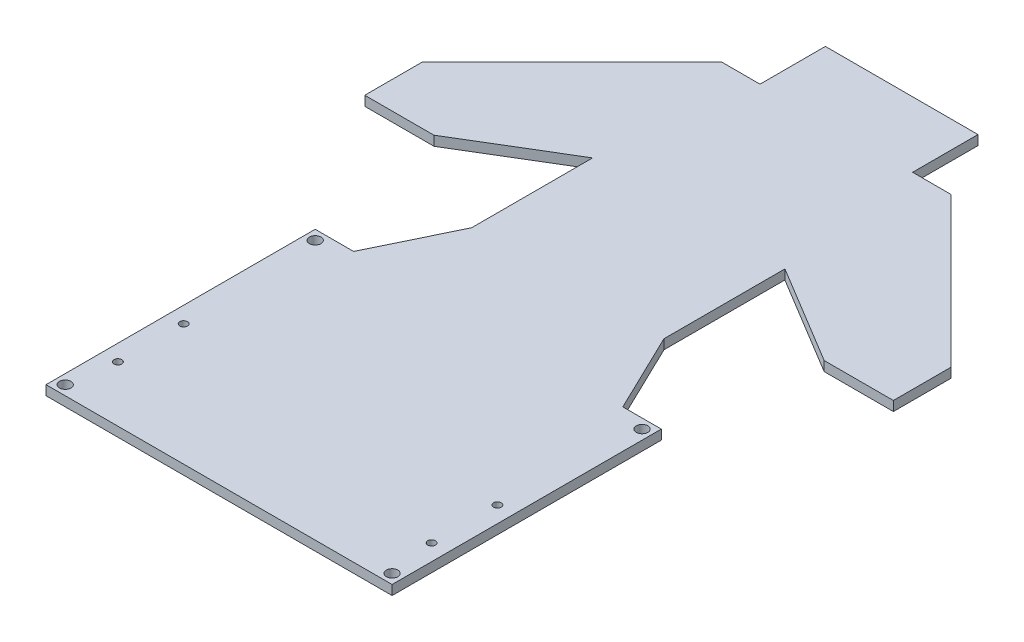
ISO-10303-21;
HEADER;
FILE_DESCRIPTION(('STEP AP214'),'2;1');
FILE_NAME('part.step','',(''),(''),'','','');
FILE_SCHEMA(('AUTOMOTIVE_DESIGN { 1 0 10303 214 1 1 1 1 }'));
ENDSEC;
DATA;
#1=APPLICATION_CONTEXT('core data for automotive mechanical design processes');
#2=APPLICATION_PROTOCOL_DEFINITION('international standard','automotive_design',2000,#1);
#3=PRODUCT_CONTEXT('',#1,'mechanical');
#4=PRODUCT('Part','Part','',(#3));
#5=PRODUCT_RELATED_PRODUCT_CATEGORY('part','',(#4));
#6=PRODUCT_DEFINITION_FORMATION('','',#4);
#7=PRODUCT_DEFINITION_CONTEXT('part definition',#1,'design');
#8=PRODUCT_DEFINITION('design','',#6,#7);
#9=PRODUCT_DEFINITION_SHAPE('','',#8);
#10=(LENGTH_UNIT() NAMED_UNIT(*) SI_UNIT(.MILLI.,.METRE.));
#11=(NAMED_UNIT(*) PLANE_ANGLE_UNIT() SI_UNIT($,.RADIAN.));
#12=(NAMED_UNIT(*) SI_UNIT($,.STERADIAN.) SOLID_ANGLE_UNIT());
#13=UNCERTAINTY_MEASURE_WITH_UNIT(LENGTH_MEASURE(1.E-05),#10,'distance_accuracy_value','');
#14=(GEOMETRIC_REPRESENTATION_CONTEXT(3) GLOBAL_UNCERTAINTY_ASSIGNED_CONTEXT((#13)) GLOBAL_UNIT_ASSIGNED_CONTEXT((#10,
#11,#12)) REPRESENTATION_CONTEXT('',''));
#15=CARTESIAN_POINT('',(0.,0.,0.));
#16=DIRECTION('',(0.,0.,1.));
#17=DIRECTION('',(1.,0.,0.));
#18=AXIS2_PLACEMENT_3D('',#15,#16,#17);
#19=CARTESIAN_POINT('',(-70.1250341022051,-2.5,-2.56438521356386));
#20=DIRECTION('',(-0.707045270994572,0.,-0.707168286028307));
#21=DIRECTION('',(-0.707168286028307,0.,0.707045270994572));
#22=AXIS2_PLACEMENT_3D('',#19,#20,#21);
#23=PLANE('',#22);
#24=DIRECTION('',(-0.707168286028307,0.,0.707045270994572));
#25=VECTOR('',#24,1.);
#26=CARTESIAN_POINT('',(-70.1250341022051,0.,-2.56438521356386));
#27=LINE('',#26,#25);
#28=CARTESIAN_POINT('',(-31.2307783706483,0.,-41.4518751182653));
#29=VERTEX_POINT('',#28);
#30=CARTESIAN_POINT('',(-70.1250341022051,0.,-2.56438521356386));
#31=VERTEX_POINT('',#30);
#32=EDGE_CURVE('E217',#29,#31,#27,.T.);
#33=ORIENTED_EDGE('',*,*,#32,.F.);
#34=DIRECTION('',(0.,1.,0.));
#35=VECTOR('',#34,1.);
#36=CARTESIAN_POINT('',(-31.2307783706483,-2.5,-41.4518751182653));
#37=LINE('',#36,#35);
#38=CARTESIAN_POINT('',(-31.2307783706483,-2.5,-41.4518751182653));
#39=VERTEX_POINT('',#38);
#40=EDGE_CURVE('E11',#39,#29,#37,.T.);
#41=ORIENTED_EDGE('',*,*,#40,.F.);
#42=DIRECTION('',(-0.707168286028307,0.,0.707045270994572));
#43=VECTOR('',#42,1.);
#44=CARTESIAN_POINT('',(-70.1250341022051,-2.5,-2.56438521356386));
#45=LINE('',#44,#43);
#46=CARTESIAN_POINT('',(-70.1250341022051,-2.5,-2.56438521356386));
#47=VERTEX_POINT('',#46);
#48=EDGE_CURVE('E280',#39,#47,#45,.T.);
#49=ORIENTED_EDGE('',*,*,#48,.T.);
#50=DIRECTION('',(0.,1.,0.));
#51=VECTOR('',#50,1.);
#52=CARTESIAN_POINT('',(-70.1250341022051,-2.5,-2.56438521356386));
#53=LINE('',#52,#51);
#54=EDGE_CURVE('E39',#47,#31,#53,.T.);
#55=ORIENTED_EDGE('',*,*,#54,.T.);
#56=EDGE_LOOP('',(#33,#41,#49,#55));
#57=FACE_BOUND('',#56,.T.);
#58=ADVANCED_FACE('F36',(#57),#23,.T.);
#59=CARTESIAN_POINT('',(-31.2307783706483,-2.5,-41.4518751182653));
#60=DIRECTION('',(0.,0.,-1.));
#61=DIRECTION('',(-1.,0.,0.));
#62=AXIS2_PLACEMENT_3D('',#59,#60,#61);
#63=PLANE('',#62);
#64=DIRECTION('',(-1.,0.,0.));
#65=VECTOR('',#64,1.);
#66=CARTESIAN_POINT('',(-31.2307783706483,0.,-41.4518751182653));
#67=LINE('',#66,#65);
#68=CARTESIAN_POINT('',(-21.2307783706483,0.,-41.4518751182653));
#69=VERTEX_POINT('',#68);
#70=EDGE_CURVE('E278',#69,#29,#67,.T.);
#71=ORIENTED_EDGE('',*,*,#70,.F.);
#72=DIRECTION('',(0.,1.,0.));
#73=VECTOR('',#72,1.);
#74=CARTESIAN_POINT('',(-21.2307783706483,-2.5,-41.4518751182653));
#75=LINE('',#74,#73);
#76=CARTESIAN_POINT('',(-21.2307783706483,-2.5,-41.4518751182653));
#77=VERTEX_POINT('',#76);
#78=EDGE_CURVE('E45',#77,#69,#75,.T.);
#79=ORIENTED_EDGE('',*,*,#78,.F.);
#80=DIRECTION('',(-1.,0.,0.));
#81=VECTOR('',#80,1.);
#82=CARTESIAN_POINT('',(-31.2307783706483,-2.5,-41.4518751182653));
#83=LINE('',#82,#81);
#84=EDGE_CURVE('E207',#77,#39,#83,.T.);
#85=ORIENTED_EDGE('',*,*,#84,.T.);
#86=ORIENTED_EDGE('',*,*,#40,.T.);
#87=EDGE_LOOP('',(#71,#79,#85,#86));
#88=FACE_BOUND('',#87,.T.);
#89=ADVANCED_FACE('F320',(#88),#63,.T.);
#90=CARTESIAN_POINT('',(-21.2307783706483,-2.5,-41.4518751182653));
#91=DIRECTION('',(-1.,0.,0.));
#92=DIRECTION('',(0.,0.,1.));
#93=AXIS2_PLACEMENT_3D('',#90,#91,#92);
#94=PLANE('',#93);
#95=DIRECTION('',(0.,0.,1.));
#96=VECTOR('',#95,1.);
#97=CARTESIAN_POINT('',(-21.2307783706483,0.,-41.4518751182653));
#98=LINE('',#97,#96);
#99=CARTESIAN_POINT('',(-21.2307783706483,0.,-58.4518751182653));
#100=VERTEX_POINT('',#99);
#101=EDGE_CURVE('E194',#100,#69,#98,.T.);
#102=ORIENTED_EDGE('',*,*,#101,.F.);
#103=DIRECTION('',(0.,1.,0.));
#104=VECTOR('',#103,1.);
#105=CARTESIAN_POINT('',(-21.2307783706483,-2.5,-58.4518751182653));
#106=LINE('',#105,#104);
#107=CARTESIAN_POINT('',(-21.2307783706483,-2.5,-58.4518751182653));
#108=VERTEX_POINT('',#107);
#109=EDGE_CURVE('E189',#108,#100,#106,.T.);
#110=ORIENTED_EDGE('',*,*,#109,.F.);
#111=DIRECTION('',(0.,0.,1.));
#112=VECTOR('',#111,1.);
#113=CARTESIAN_POINT('',(-21.2307783706483,-2.5,-41.4518751182653));
#114=LINE('',#113,#112);
#115=EDGE_CURVE('E192',#108,#77,#114,.T.);
#116=ORIENTED_EDGE('',*,*,#115,.T.);
#117=ORIENTED_EDGE('',*,*,#78,.T.);
#118=EDGE_LOOP('',(#102,#110,#116,#117));
#119=FACE_BOUND('',#118,.T.);
#120=ADVANCED_FACE('F191',(#119),#94,.T.);
#121=CARTESIAN_POINT('',(-21.2307783706483,-2.5,-58.4518751182653));
#122=DIRECTION('',(0.,0.,-1.));
#123=DIRECTION('',(-1.,0.,0.));
#124=AXIS2_PLACEMENT_3D('',#121,#122,#123);
#125=PLANE('',#124);
#126=DIRECTION('',(-1.,0.,0.));
#127=VECTOR('',#126,1.);
#128=CARTESIAN_POINT('',(-21.2307783706483,0.,-58.4518751182653));
#129=LINE('',#128,#127);
#130=CARTESIAN_POINT('',(18.4572130723463,0.,-58.4518751182653));
#131=VERTEX_POINT('',#130);
#132=EDGE_CURVE('E275',#131,#100,#129,.T.);
#133=ORIENTED_EDGE('',*,*,#132,.F.);
#134=DIRECTION('',(0.,1.,0.));
#135=VECTOR('',#134,1.);
#136=CARTESIAN_POINT('',(18.4572130723463,-2.5,-58.4518751182653));
#137=LINE('',#136,#135);
#138=CARTESIAN_POINT('',(18.4572130723463,-2.5,-58.4518751182653));
#139=VERTEX_POINT('',#138);
#140=EDGE_CURVE('E199',#139,#131,#137,.T.);
#141=ORIENTED_EDGE('',*,*,#140,.F.);
#142=DIRECTION('',(-1.,0.,0.));
#143=VECTOR('',#142,1.);
#144=CARTESIAN_POINT('',(-21.2307783706483,-2.5,-58.4518751182653));
#145=LINE('',#144,#143);
#146=EDGE_CURVE('E205',#139,#108,#145,.T.);
#147=ORIENTED_EDGE('',*,*,#146,.T.);
#148=ORIENTED_EDGE('',*,*,#109,.T.);
#149=EDGE_LOOP('',(#133,#141,#147,#148));
#150=FACE_BOUND('',#149,.T.);
#151=ADVANCED_FACE('F209',(#150),#125,.T.);
#152=CARTESIAN_POINT('',(18.4572130723463,-2.5,-58.4518751182653));
#153=DIRECTION('',(1.,0.,0.));
#154=DIRECTION('',(0.,0.,-1.));
#155=AXIS2_PLACEMENT_3D('',#152,#153,#154);
#156=PLANE('',#155);
#157=DIRECTION('',(0.,0.,-1.));
#158=VECTOR('',#157,1.);
#159=CARTESIAN_POINT('',(18.4572130723463,0.,-58.4518751182653));
#160=LINE('',#159,#158);
#161=CARTESIAN_POINT('',(18.4572130723463,0.,-41.4518751182653));
#162=VERTEX_POINT('',#161);
#163=EDGE_CURVE('E272',#162,#131,#160,.T.);
#164=ORIENTED_EDGE('',*,*,#163,.F.);
#165=DIRECTION('',(0.,1.,0.));
#166=VECTOR('',#165,1.);
#167=CARTESIAN_POINT('',(18.4572130723463,-2.5,-41.4518751182653));
#168=LINE('',#167,#166);
#169=CARTESIAN_POINT('',(18.4572130723463,-2.5,-41.4518751182653));
#170=VERTEX_POINT('',#169);
#171=EDGE_CURVE('E284',#170,#162,#168,.T.);
#172=ORIENTED_EDGE('',*,*,#171,.F.);
#173=DIRECTION('',(0.,0.,-1.));
#174=VECTOR('',#173,1.);
#175=CARTESIAN_POINT('',(18.4572130723463,-2.5,-58.4518751182653));
#176=LINE('',#175,#174);
#177=EDGE_CURVE('E210',#170,#139,#176,.T.);
#178=ORIENTED_EDGE('',*,*,#177,.T.);
#179=ORIENTED_EDGE('',*,*,#140,.T.);
#180=EDGE_LOOP('',(#164,#172,#178,#179));
#181=FACE_BOUND('',#180,.T.);
#182=ADVANCED_FACE('F333',(#181),#156,.T.);
#183=CARTESIAN_POINT('',(18.4572130723463,-2.5,-41.4518751182653));
#184=DIRECTION('',(0.,0.,-1.));
#185=DIRECTION('',(-1.,0.,0.));
#186=AXIS2_PLACEMENT_3D('',#183,#184,#185);
#187=PLANE('',#186);
#188=DIRECTION('',(-1.,0.,0.));
#189=VECTOR('',#188,1.);
#190=CARTESIAN_POINT('',(18.4572130723463,0.,-41.4518751182653));
#191=LINE('',#190,#189);
#192=CARTESIAN_POINT('',(28.4572130723463,0.,-41.4518751182653));
#193=VERTEX_POINT('',#192);
#194=EDGE_CURVE('E269',#193,#162,#191,.T.);
#195=ORIENTED_EDGE('',*,*,#194,.F.);
#196=DIRECTION('',(0.,1.,0.));
#197=VECTOR('',#196,1.);
#198=CARTESIAN_POINT('',(28.4572130723463,-2.5,-41.4518751182653));
#199=LINE('',#198,#197);
#200=CARTESIAN_POINT('',(28.4572130723463,-2.5,-41.4518751182653));
#201=VERTEX_POINT('',#200);
#202=EDGE_CURVE('E286',#201,#193,#199,.T.);
#203=ORIENTED_EDGE('',*,*,#202,.F.);
#204=DIRECTION('',(-1.,0.,0.));
#205=VECTOR('',#204,1.);
#206=CARTESIAN_POINT('',(18.4572130723463,-2.5,-41.4518751182653));
#207=LINE('',#206,#205);
#208=EDGE_CURVE('E212',#201,#170,#207,.T.);
#209=ORIENTED_EDGE('',*,*,#208,.T.);
#210=ORIENTED_EDGE('',*,*,#171,.T.);
#211=EDGE_LOOP('',(#195,#203,#209,#210));
#212=FACE_BOUND('',#211,.T.);
#213=ADVANCED_FACE('F336',(#212),#187,.T.);
#214=CARTESIAN_POINT('',(28.4572130723463,-2.5,-41.4518751182653));
#215=DIRECTION('',(0.707168286028307,0.,-0.707045270994571));
#216=DIRECTION('',(-0.707045270994572,0.,-0.707168286028307));
#217=AXIS2_PLACEMENT_3D('',#214,#215,#216);
#218=PLANE('',#217);
#219=DIRECTION('',(-0.707045270994571,0.,-0.707168286028307));
#220=VECTOR('',#219,1.);
#221=CARTESIAN_POINT('',(28.4572130723463,0.,-41.4518751182653));
#222=LINE('',#221,#220);
#223=CARTESIAN_POINT('',(67.3447029770478,0.,-2.55761938670842));
#224=VERTEX_POINT('',#223);
#225=EDGE_CURVE('E266',#224,#193,#222,.T.);
#226=ORIENTED_EDGE('',*,*,#225,.F.);
#227=DIRECTION('',(0.,1.,0.));
#228=VECTOR('',#227,1.);
#229=CARTESIAN_POINT('',(67.3447029770478,-2.5,-2.55761938670842));
#230=LINE('',#229,#228);
#231=CARTESIAN_POINT('',(67.3447029770478,-2.5,-2.55761938670842));
#232=VERTEX_POINT('',#231);
#233=EDGE_CURVE('E288',#232,#224,#230,.T.);
#234=ORIENTED_EDGE('',*,*,#233,.F.);
#235=DIRECTION('',(-0.707045270994571,0.,-0.707168286028307));
#236=VECTOR('',#235,1.);
#237=CARTESIAN_POINT('',(28.4572130723463,-2.5,-41.4518751182653));
#238=LINE('',#237,#236);
#239=EDGE_CURVE('E541',#232,#201,#238,.T.);
#240=ORIENTED_EDGE('',*,*,#239,.T.);
#241=ORIENTED_EDGE('',*,*,#202,.T.);
#242=EDGE_LOOP('',(#226,#234,#240,#241));
#243=FACE_BOUND('',#242,.T.);
#244=ADVANCED_FACE('F340',(#243),#218,.T.);
#245=CARTESIAN_POINT('',(67.3447029770478,-2.5,-2.55761938670842));
#246=DIRECTION('',(1.,0.,0.));
#247=DIRECTION('',(0.,0.,-1.));
#248=AXIS2_PLACEMENT_3D('',#245,#246,#247);
#249=PLANE('',#248);
#250=DIRECTION('',(0.,0.,-1.));
#251=VECTOR('',#250,1.);
#252=CARTESIAN_POINT('',(67.3447029770478,0.,-2.55761938670842));
#253=LINE('',#252,#251);
#254=CARTESIAN_POINT('',(67.3447029770478,0.,12.4423806132916));
#255=VERTEX_POINT('',#254);
#256=EDGE_CURVE('E263',#255,#224,#253,.T.);
#257=ORIENTED_EDGE('',*,*,#256,.F.);
#258=DIRECTION('',(0.,1.,0.));
#259=VECTOR('',#258,1.);
#260=CARTESIAN_POINT('',(67.3447029770478,-2.5,12.4423806132916));
#261=LINE('',#260,#259);
#262=CARTESIAN_POINT('',(67.3447029770478,-2.5,12.4423806132916));
#263=VERTEX_POINT('',#262);
#264=EDGE_CURVE('E290',#263,#255,#261,.T.);
#265=ORIENTED_EDGE('',*,*,#264,.F.);
#266=DIRECTION('',(0.,0.,-1.));
#267=VECTOR('',#266,1.);
#268=CARTESIAN_POINT('',(67.3447029770478,-2.5,-2.55761938670842));
#269=LINE('',#268,#267);
#270=EDGE_CURVE('E538',#263,#232,#269,.T.);
#271=ORIENTED_EDGE('',*,*,#270,.T.);
#272=ORIENTED_EDGE('',*,*,#233,.T.);
#273=EDGE_LOOP('',(#257,#265,#271,#272));
#274=FACE_BOUND('',#273,.T.);
#275=ADVANCED_FACE('F344',(#274),#249,.T.);
#276=CARTESIAN_POINT('',(67.3447029770478,-2.5,12.4423806132916));
#277=DIRECTION('',(0.,0.,1.));
#278=DIRECTION('',(1.,0.,0.));
#279=AXIS2_PLACEMENT_3D('',#276,#277,#278);
#280=PLANE('',#279);
#281=DIRECTION('',(1.,0.,0.));
#282=VECTOR('',#281,1.);
#283=CARTESIAN_POINT('',(67.3447029770478,0.,12.4423806132916));
#284=LINE('',#283,#282);
#285=CARTESIAN_POINT('',(49.3447029770478,0.,12.4423806132916));
#286=VERTEX_POINT('',#285);
#287=EDGE_CURVE('E260',#286,#255,#284,.T.);
#288=ORIENTED_EDGE('',*,*,#287,.F.);
#289=DIRECTION('',(0.,1.,0.));
#290=VECTOR('',#289,1.);
#291=CARTESIAN_POINT('',(49.3447029770478,-2.5,12.4423806132916));
#292=LINE('',#291,#290);
#293=CARTESIAN_POINT('',(49.3447029770478,-2.5,12.4423806132916));
#294=VERTEX_POINT('',#293);
#295=EDGE_CURVE('E292',#294,#286,#292,.T.);
#296=ORIENTED_EDGE('',*,*,#295,.F.);
#297=DIRECTION('',(1.,0.,0.));
#298=VECTOR('',#297,1.);
#299=CARTESIAN_POINT('',(67.3447029770478,-2.5,12.4423806132916));
#300=LINE('',#299,#298);
#301=EDGE_CURVE('E535',#294,#263,#300,.T.);
#302=ORIENTED_EDGE('',*,*,#301,.T.);
#303=ORIENTED_EDGE('',*,*,#264,.T.);
#304=EDGE_LOOP('',(#288,#296,#302,#303));
#305=FACE_BOUND('',#304,.T.);
#306=ADVANCED_FACE('F348',(#305),#280,.T.);
#307=CARTESIAN_POINT('',(23.6118753411253,-2.5,-3.08678788269153));
#308=DIRECTION('',(-0.516682968311014,0.,0.856176798481084));
#309=DIRECTION('',(0.856176798481084,0.,0.516682968311014));
#310=AXIS2_PLACEMENT_3D('',#307,#308,#309);
#311=PLANE('',#310);
#312=DIRECTION('',(0.856176798481084,0.,0.516682968311014));
#313=VECTOR('',#312,1.);
#314=CARTESIAN_POINT('',(23.6118753411253,0.,-3.08678788269153));
#315=LINE('',#314,#313);
#316=CARTESIAN_POINT('',(23.6118753411253,0.,-3.08678788269153));
#317=VERTEX_POINT('',#316);
#318=EDGE_CURVE('E257',#317,#286,#315,.T.);
#319=ORIENTED_EDGE('',*,*,#318,.F.);
#320=DIRECTION('',(0.,1.,0.));
#321=VECTOR('',#320,1.);
#322=CARTESIAN_POINT('',(23.6118753411253,-2.5,-3.08678788269153));
#323=LINE('',#322,#321);
#324=CARTESIAN_POINT('',(23.6118753411253,-2.5,-3.08678788269153));
#325=VERTEX_POINT('',#324);
#326=EDGE_CURVE('E294',#325,#317,#323,.T.);
#327=ORIENTED_EDGE('',*,*,#326,.F.);
#328=DIRECTION('',(0.856176798481084,0.,0.516682968311014));
#329=VECTOR('',#328,1.);
#330=CARTESIAN_POINT('',(23.6118753411253,-2.5,-3.08678788269153));
#331=LINE('',#330,#329);
#332=EDGE_CURVE('E532',#325,#294,#331,.T.);
#333=ORIENTED_EDGE('',*,*,#332,.T.);
#334=ORIENTED_EDGE('',*,*,#295,.T.);
#335=EDGE_LOOP('',(#319,#327,#333,#334));
#336=FACE_BOUND('',#335,.T.);
#337=ADVANCED_FACE('F352',(#336),#311,.T.);
#338=CARTESIAN_POINT('',(23.6118753411253,-2.5,28.3689413328497));
#339=DIRECTION('',(1.,0.,0.));
#340=DIRECTION('',(0.,0.,-1.));
#341=AXIS2_PLACEMENT_3D('',#338,#339,#340);
#342=PLANE('',#341);
#343=DIRECTION('',(0.,0.,-1.));
#344=VECTOR('',#343,1.);
#345=CARTESIAN_POINT('',(23.6118753411253,0.,28.3689413328497));
#346=LINE('',#345,#344);
#347=CARTESIAN_POINT('',(23.6118753411253,0.,28.3689413328497));
#348=VERTEX_POINT('',#347);
#349=EDGE_CURVE('E254',#348,#317,#346,.T.);
#350=ORIENTED_EDGE('',*,*,#349,.F.);
#351=DIRECTION('',(0.,1.,0.));
#352=VECTOR('',#351,1.);
#353=CARTESIAN_POINT('',(23.6118753411253,-2.5,28.3689413328497));
#354=LINE('',#353,#352);
#355=CARTESIAN_POINT('',(23.6118753411253,-2.5,28.3689413328497));
#356=VERTEX_POINT('',#355);
#357=EDGE_CURVE('E296',#356,#348,#354,.T.);
#358=ORIENTED_EDGE('',*,*,#357,.F.);
#359=DIRECTION('',(0.,0.,-1.));
#360=VECTOR('',#359,1.);
#361=CARTESIAN_POINT('',(23.6118753411253,-2.5,28.3689413328497));
#362=LINE('',#361,#360);
#363=EDGE_CURVE('E529',#356,#325,#362,.T.);
#364=ORIENTED_EDGE('',*,*,#363,.T.);
#365=ORIENTED_EDGE('',*,*,#326,.T.);
#366=EDGE_LOOP('',(#350,#358,#364,#365));
#367=FACE_BOUND('',#366,.T.);
#368=ADVANCED_FACE('F356',(#367),#342,.T.);
#369=CARTESIAN_POINT('',(23.6118753411253,-2.5,28.3689413328497));
#370=DIRECTION('',(0.900375036184463,0.,-0.435114690875666));
#371=DIRECTION('',(-0.435114690875666,0.,-0.900375036184463));
#372=AXIS2_PLACEMENT_3D('',#369,#370,#371);
#373=PLANE('',#372);
#374=DIRECTION('',(-0.435114690875666,0.,-0.900375036184463));
#375=VECTOR('',#374,1.);
#376=CARTESIAN_POINT('',(23.6118753411253,0.,28.3689413328497));
#377=LINE('',#376,#375);
#378=CARTESIAN_POINT('',(33.6118753411252,0.,49.0617622158326));
#379=VERTEX_POINT('',#378);
#380=EDGE_CURVE('E251',#379,#348,#377,.T.);
#381=ORIENTED_EDGE('',*,*,#380,.F.);
#382=DIRECTION('',(0.,1.,0.));
#383=VECTOR('',#382,1.);
#384=CARTESIAN_POINT('',(33.6118753411252,-2.5,49.0617622158326));
#385=LINE('',#384,#383);
#386=CARTESIAN_POINT('',(33.6118753411252,-2.5,49.0617622158326));
#387=VERTEX_POINT('',#386);
#388=EDGE_CURVE('E298',#387,#379,#385,.T.);
#389=ORIENTED_EDGE('',*,*,#388,.F.);
#390=DIRECTION('',(-0.435114690875666,0.,-0.900375036184463));
#391=VECTOR('',#390,1.);
#392=CARTESIAN_POINT('',(23.6118753411253,-2.5,28.3689413328497));
#393=LINE('',#392,#391);
#394=EDGE_CURVE('E526',#387,#356,#393,.T.);
#395=ORIENTED_EDGE('',*,*,#394,.T.);
#396=ORIENTED_EDGE('',*,*,#357,.T.);
#397=EDGE_LOOP('',(#381,#389,#395,#396));
#398=FACE_BOUND('',#397,.T.);
#399=ADVANCED_FACE('F360',(#398),#373,.T.);
#400=CARTESIAN_POINT('',(43.6118753411252,-2.5,49.0617622158326));
#401=DIRECTION('',(0.,0.,-1.));
#402=DIRECTION('',(-1.,0.,0.));
#403=AXIS2_PLACEMENT_3D('',#400,#401,#402);
#404=PLANE('',#403);
#405=DIRECTION('',(-1.,0.,0.));
#406=VECTOR('',#405,1.);
#407=CARTESIAN_POINT('',(43.6118753411252,0.,49.0617622158326));
#408=LINE('',#407,#406);
#409=CARTESIAN_POINT('',(43.6118753411252,0.,49.0617622158326));
#410=VERTEX_POINT('',#409);
#411=EDGE_CURVE('E248',#410,#379,#408,.T.);
#412=ORIENTED_EDGE('',*,*,#411,.F.);
#413=DIRECTION('',(0.,1.,0.));
#414=VECTOR('',#413,1.);
#415=CARTESIAN_POINT('',(43.6118753411252,-2.5,49.0617622158326));
#416=LINE('',#415,#414);
#417=CARTESIAN_POINT('',(43.6118753411252,-2.5,49.0617622158326));
#418=VERTEX_POINT('',#417);
#419=EDGE_CURVE('E300',#418,#410,#416,.T.);
#420=ORIENTED_EDGE('',*,*,#419,.F.);
#421=DIRECTION('',(-1.,0.,0.));
#422=VECTOR('',#421,1.);
#423=CARTESIAN_POINT('',(43.6118753411252,-2.5,49.0617622158326));
#424=LINE('',#423,#422);
#425=EDGE_CURVE('E523',#418,#387,#424,.T.);
#426=ORIENTED_EDGE('',*,*,#425,.T.);
#427=ORIENTED_EDGE('',*,*,#388,.T.);
#428=EDGE_LOOP('',(#412,#420,#426,#427));
#429=FACE_BOUND('',#428,.T.);
#430=ADVANCED_FACE('F364',(#429),#404,.T.);
#431=CARTESIAN_POINT('',(43.6118753411252,-2.5,119.061762215833));
#432=DIRECTION('',(1.,0.,0.));
#433=DIRECTION('',(0.,0.,-1.));
#434=AXIS2_PLACEMENT_3D('',#431,#432,#433);
#435=PLANE('',#434);
#436=DIRECTION('',(0.,0.,-1.));
#437=VECTOR('',#436,1.);
#438=CARTESIAN_POINT('',(43.6118753411252,0.,119.061762215833));
#439=LINE('',#438,#437);
#440=CARTESIAN_POINT('',(43.6118753411252,0.,119.061762215833));
#441=VERTEX_POINT('',#440);
#442=EDGE_CURVE('E245',#441,#410,#439,.T.);
#443=ORIENTED_EDGE('',*,*,#442,.F.);
#444=DIRECTION('',(0.,1.,0.));
#445=VECTOR('',#444,1.);
#446=CARTESIAN_POINT('',(43.6118753411252,-2.5,119.061762215833));
#447=LINE('',#446,#445);
#448=CARTESIAN_POINT('',(43.6118753411252,-2.5,119.061762215833));
#449=VERTEX_POINT('',#448);
#450=EDGE_CURVE('E302',#449,#441,#447,.T.);
#451=ORIENTED_EDGE('',*,*,#450,.F.);
#452=DIRECTION('',(0.,0.,-1.));
#453=VECTOR('',#452,1.);
#454=CARTESIAN_POINT('',(43.6118753411252,-2.5,119.061762215833));
#455=LINE('',#454,#453);
#456=EDGE_CURVE('E520',#449,#418,#455,.T.);
#457=ORIENTED_EDGE('',*,*,#456,.T.);
#458=ORIENTED_EDGE('',*,*,#419,.T.);
#459=EDGE_LOOP('',(#443,#451,#457,#458));
#460=FACE_BOUND('',#459,.T.);
#461=ADVANCED_FACE('F368',(#460),#435,.T.);
#462=CARTESIAN_POINT('',(-46.3881246588748,-2.5,119.061762215833));
#463=DIRECTION('',(0.,0.,1.));
#464=DIRECTION('',(1.,0.,0.));
#465=AXIS2_PLACEMENT_3D('',#462,#463,#464);
#466=PLANE('',#465);
#467=DIRECTION('',(1.,0.,0.));
#468=VECTOR('',#467,1.);
#469=CARTESIAN_POINT('',(-46.3881246588748,0.,119.061762215833));
#470=LINE('',#469,#468);
#471=CARTESIAN_POINT('',(-46.3881246588748,0.,119.061762215833));
#472=VERTEX_POINT('',#471);
#473=EDGE_CURVE('E242',#472,#441,#470,.T.);
#474=ORIENTED_EDGE('',*,*,#473,.F.);
#475=DIRECTION('',(0.,1.,0.));
#476=VECTOR('',#475,1.);
#477=CARTESIAN_POINT('',(-46.3881246588748,-2.5,119.061762215833));
#478=LINE('',#477,#476);
#479=CARTESIAN_POINT('',(-46.3881246588748,-2.5,119.061762215833));
#480=VERTEX_POINT('',#479);
#481=EDGE_CURVE('E304',#480,#472,#478,.T.);
#482=ORIENTED_EDGE('',*,*,#481,.F.);
#483=DIRECTION('',(1.,0.,0.));
#484=VECTOR('',#483,1.);
#485=CARTESIAN_POINT('',(-46.3881246588748,-2.5,119.061762215833));
#486=LINE('',#485,#484);
#487=EDGE_CURVE('E517',#480,#449,#486,.T.);
#488=ORIENTED_EDGE('',*,*,#487,.T.);
#489=ORIENTED_EDGE('',*,*,#450,.T.);
#490=EDGE_LOOP('',(#474,#482,#488,#489));
#491=FACE_BOUND('',#490,.T.);
#492=ADVANCED_FACE('F372',(#491),#466,.T.);
#493=CARTESIAN_POINT('',(-46.3881246588748,-2.5,49.0617622158326));
#494=DIRECTION('',(-1.,0.,0.));
#495=DIRECTION('',(0.,0.,1.));
#496=AXIS2_PLACEMENT_3D('',#493,#494,#495);
#497=PLANE('',#496);
#498=DIRECTION('',(0.,0.,1.));
#499=VECTOR('',#498,1.);
#500=CARTESIAN_POINT('',(-46.3881246588748,0.,49.0617622158326));
#501=LINE('',#500,#499);
#502=CARTESIAN_POINT('',(-46.3881246588748,0.,49.0617622158326));
#503=VERTEX_POINT('',#502);
#504=EDGE_CURVE('E239',#503,#472,#501,.T.);
#505=ORIENTED_EDGE('',*,*,#504,.F.);
#506=DIRECTION('',(0.,1.,0.));
#507=VECTOR('',#506,1.);
#508=CARTESIAN_POINT('',(-46.3881246588748,-2.5,49.0617622158326));
#509=LINE('',#508,#507);
#510=CARTESIAN_POINT('',(-46.3881246588748,-2.5,49.0617622158326));
#511=VERTEX_POINT('',#510);
#512=EDGE_CURVE('E306',#511,#503,#509,.T.);
#513=ORIENTED_EDGE('',*,*,#512,.F.);
#514=DIRECTION('',(0.,0.,1.));
#515=VECTOR('',#514,1.);
#516=CARTESIAN_POINT('',(-46.3881246588748,-2.5,49.0617622158326));
#517=LINE('',#516,#515);
#518=EDGE_CURVE('E514',#511,#480,#517,.T.);
#519=ORIENTED_EDGE('',*,*,#518,.T.);
#520=ORIENTED_EDGE('',*,*,#481,.T.);
#521=EDGE_LOOP('',(#505,#513,#519,#520));
#522=FACE_BOUND('',#521,.T.);
#523=ADVANCED_FACE('F376',(#522),#497,.T.);
#524=CARTESIAN_POINT('',(-36.3881246588747,-2.5,49.0617622158326));
#525=DIRECTION('',(0.,0.,-1.));
#526=DIRECTION('',(-1.,0.,0.));
#527=AXIS2_PLACEMENT_3D('',#524,#525,#526);
#528=PLANE('',#527);
#529=DIRECTION('',(-1.,0.,0.));
#530=VECTOR('',#529,1.);
#531=CARTESIAN_POINT('',(-36.3881246588747,0.,49.0617622158326));
#532=LINE('',#531,#530);
#533=CARTESIAN_POINT('',(-36.3881246588747,0.,49.0617622158326));
#534=VERTEX_POINT('',#533);
#535=EDGE_CURVE('E236',#534,#503,#532,.T.);
#536=ORIENTED_EDGE('',*,*,#535,.F.);
#537=DIRECTION('',(0.,1.,0.));
#538=VECTOR('',#537,1.);
#539=CARTESIAN_POINT('',(-36.3881246588747,-2.5,49.0617622158326));
#540=LINE('',#539,#538);
#541=CARTESIAN_POINT('',(-36.3881246588747,-2.5,49.0617622158326));
#542=VERTEX_POINT('',#541);
#543=EDGE_CURVE('E308',#542,#534,#540,.T.);
#544=ORIENTED_EDGE('',*,*,#543,.F.);
#545=DIRECTION('',(-1.,0.,0.));
#546=VECTOR('',#545,1.);
#547=CARTESIAN_POINT('',(-36.3881246588747,-2.5,49.0617622158326));
#548=LINE('',#547,#546);
#549=EDGE_CURVE('E511',#542,#511,#548,.T.);
#550=ORIENTED_EDGE('',*,*,#549,.T.);
#551=ORIENTED_EDGE('',*,*,#512,.T.);
#552=EDGE_LOOP('',(#536,#544,#550,#551));
#553=FACE_BOUND('',#552,.T.);
#554=ADVANCED_FACE('F380',(#553),#528,.T.);
#555=CARTESIAN_POINT('',(-36.3881246588747,-2.5,49.0617622158326));
#556=DIRECTION('',(-0.900375036184463,0.,-0.435114690875667));
#557=DIRECTION('',(-0.435114690875667,0.,0.900375036184463));
#558=AXIS2_PLACEMENT_3D('',#555,#556,#557);
#559=PLANE('',#558);
#560=DIRECTION('',(-0.435114690875667,0.,0.900375036184463));
#561=VECTOR('',#560,1.);
#562=CARTESIAN_POINT('',(-36.3881246588747,0.,49.0617622158326));
#563=LINE('',#562,#561);
#564=CARTESIAN_POINT('',(-26.3881246588747,0.,28.3689413328497));
#565=VERTEX_POINT('',#564);
#566=EDGE_CURVE('E233',#565,#534,#563,.T.);
#567=ORIENTED_EDGE('',*,*,#566,.F.);
#568=DIRECTION('',(0.,1.,0.));
#569=VECTOR('',#568,1.);
#570=CARTESIAN_POINT('',(-26.3881246588747,-2.5,28.3689413328497));
#571=LINE('',#570,#569);
#572=CARTESIAN_POINT('',(-26.3881246588747,-2.5,28.3689413328497));
#573=VERTEX_POINT('',#572);
#574=EDGE_CURVE('E310',#573,#565,#571,.T.);
#575=ORIENTED_EDGE('',*,*,#574,.F.);
#576=DIRECTION('',(-0.435114690875667,0.,0.900375036184463));
#577=VECTOR('',#576,1.);
#578=CARTESIAN_POINT('',(-36.3881246588747,-2.5,49.0617622158326));
#579=LINE('',#578,#577);
#580=EDGE_CURVE('E508',#573,#542,#579,.T.);
#581=ORIENTED_EDGE('',*,*,#580,.T.);
#582=ORIENTED_EDGE('',*,*,#543,.T.);
#583=EDGE_LOOP('',(#567,#575,#581,#582));
#584=FACE_BOUND('',#583,.T.);
#585=ADVANCED_FACE('F384',(#584),#559,.T.);
#586=CARTESIAN_POINT('',(-26.3881246588747,-2.5,28.3689413328497));
#587=DIRECTION('',(-1.,0.,0.));
#588=DIRECTION('',(0.,0.,1.));
#589=AXIS2_PLACEMENT_3D('',#586,#587,#588);
#590=PLANE('',#589);
#591=DIRECTION('',(0.,0.,1.));
#592=VECTOR('',#591,1.);
#593=CARTESIAN_POINT('',(-26.3881246588747,0.,28.3689413328497));
#594=LINE('',#593,#592);
#595=CARTESIAN_POINT('',(-26.3881246588747,0.,-3.08678788269148));
#596=VERTEX_POINT('',#595);
#597=EDGE_CURVE('E230',#596,#565,#594,.T.);
#598=ORIENTED_EDGE('',*,*,#597,.F.);
#599=DIRECTION('',(0.,1.,0.));
#600=VECTOR('',#599,1.);
#601=CARTESIAN_POINT('',(-26.3881246588747,-2.5,-3.08678788269148));
#602=LINE('',#601,#600);
#603=CARTESIAN_POINT('',(-26.3881246588747,-2.5,-3.08678788269148));
#604=VERTEX_POINT('',#603);
#605=EDGE_CURVE('E312',#604,#596,#602,.T.);
#606=ORIENTED_EDGE('',*,*,#605,.F.);
#607=DIRECTION('',(0.,0.,1.));
#608=VECTOR('',#607,1.);
#609=CARTESIAN_POINT('',(-26.3881246588747,-2.5,28.3689413328497));
#610=LINE('',#609,#608);
#611=EDGE_CURVE('E505',#604,#573,#610,.T.);
#612=ORIENTED_EDGE('',*,*,#611,.T.);
#613=ORIENTED_EDGE('',*,*,#574,.T.);
#614=EDGE_LOOP('',(#598,#606,#612,#613));
#615=FACE_BOUND('',#614,.T.);
#616=ADVANCED_FACE('F388',(#615),#590,.T.);
#617=CARTESIAN_POINT('',(-26.3881246588747,-2.5,-3.08678788269148));
#618=DIRECTION('',(0.516457857256055,0.,0.856312607450389));
#619=DIRECTION('',(0.856312607450389,0.,-0.516457857256055));
#620=AXIS2_PLACEMENT_3D('',#617,#618,#619);
#621=PLANE('',#620);
#622=DIRECTION('',(0.856312607450389,0.,-0.516457857256055));
#623=VECTOR('',#622,1.);
#624=CARTESIAN_POINT('',(-26.3881246588747,0.,-3.08678788269148));
#625=LINE('',#624,#623);
#626=CARTESIAN_POINT('',(-52.1250341022051,0.,12.4356147864361));
#627=VERTEX_POINT('',#626);
#628=EDGE_CURVE('E227',#627,#596,#625,.T.);
#629=ORIENTED_EDGE('',*,*,#628,.F.);
#630=DIRECTION('',(0.,1.,0.));
#631=VECTOR('',#630,1.);
#632=CARTESIAN_POINT('',(-52.1250341022051,-2.5,12.4356147864361));
#633=LINE('',#632,#631);
#634=CARTESIAN_POINT('',(-52.1250341022051,-2.5,12.4356147864361));
#635=VERTEX_POINT('',#634);
#636=EDGE_CURVE('E314',#635,#627,#633,.T.);
#637=ORIENTED_EDGE('',*,*,#636,.F.);
#638=DIRECTION('',(0.856312607450389,0.,-0.516457857256055));
#639=VECTOR('',#638,1.);
#640=CARTESIAN_POINT('',(-26.3881246588747,-2.5,-3.08678788269148));
#641=LINE('',#640,#639);
#642=EDGE_CURVE('E502',#635,#604,#641,.T.);
#643=ORIENTED_EDGE('',*,*,#642,.T.);
#644=ORIENTED_EDGE('',*,*,#605,.T.);
#645=EDGE_LOOP('',(#629,#637,#643,#644));
#646=FACE_BOUND('',#645,.T.);
#647=ADVANCED_FACE('F392',(#646),#621,.T.);
#648=CARTESIAN_POINT('',(-52.1250341022051,-2.5,12.4356147864361));
#649=DIRECTION('',(0.,0.,1.));
#650=DIRECTION('',(1.,0.,0.));
#651=AXIS2_PLACEMENT_3D('',#648,#649,#650);
#652=PLANE('',#651);
#653=DIRECTION('',(1.,0.,0.));
#654=VECTOR('',#653,1.);
#655=CARTESIAN_POINT('',(-52.1250341022051,0.,12.4356147864361));
#656=LINE('',#655,#654);
#657=CARTESIAN_POINT('',(-70.1250341022051,0.,12.4356147864361));
#658=VERTEX_POINT('',#657);
#659=EDGE_CURVE('E224',#658,#627,#656,.T.);
#660=ORIENTED_EDGE('',*,*,#659,.F.);
#661=DIRECTION('',(0.,1.,0.));
#662=VECTOR('',#661,1.);
#663=CARTESIAN_POINT('',(-70.1250341022051,-2.5,12.4356147864361));
#664=LINE('',#663,#662);
#665=CARTESIAN_POINT('',(-70.1250341022051,-2.5,12.4356147864361));
#666=VERTEX_POINT('',#665);
#667=EDGE_CURVE('E315',#666,#658,#664,.T.);
#668=ORIENTED_EDGE('',*,*,#667,.F.);
#669=DIRECTION('',(1.,0.,0.));
#670=VECTOR('',#669,1.);
#671=CARTESIAN_POINT('',(-52.1250341022051,-2.5,12.4356147864361));
#672=LINE('',#671,#670);
#673=EDGE_CURVE('E499',#666,#635,#672,.T.);
#674=ORIENTED_EDGE('',*,*,#673,.T.);
#675=ORIENTED_EDGE('',*,*,#636,.T.);
#676=EDGE_LOOP('',(#660,#668,#674,#675));
#677=FACE_BOUND('',#676,.T.);
#678=ADVANCED_FACE('F396',(#677),#652,.T.);
#679=CARTESIAN_POINT('',(-70.1250341022051,-2.5,12.4356147864361));
#680=DIRECTION('',(-1.,0.,0.));
#681=DIRECTION('',(0.,0.,1.));
#682=AXIS2_PLACEMENT_3D('',#679,#680,#681);
#683=PLANE('',#682);
#684=DIRECTION('',(0.,0.,1.));
#685=VECTOR('',#684,1.);
#686=CARTESIAN_POINT('',(-70.1250341022051,0.,12.4356147864361));
#687=LINE('',#686,#685);
#688=EDGE_CURVE('E220',#31,#658,#687,.T.);
#689=ORIENTED_EDGE('',*,*,#688,.F.);
#690=ORIENTED_EDGE('',*,*,#54,.F.);
#691=DIRECTION('',(0.,0.,1.));
#692=VECTOR('',#691,1.);
#693=CARTESIAN_POINT('',(-70.1250341022051,-2.5,12.4356147864361));
#694=LINE('',#693,#692);
#695=EDGE_CURVE('E497',#47,#666,#694,.T.);
#696=ORIENTED_EDGE('',*,*,#695,.T.);
#697=ORIENTED_EDGE('',*,*,#667,.T.);
#698=EDGE_LOOP('',(#689,#690,#696,#697));
#699=FACE_BOUND('',#698,.T.);
#700=ADVANCED_FACE('F317',(#699),#683,.T.);
#701=CARTESIAN_POINT('',(0.,-2.5,0.));
#702=DIRECTION('',(0.,-1.,0.));
#703=DIRECTION('',(0.,0.,-1.));
#704=AXIS2_PLACEMENT_3D('',#701,#702,#703);
#705=PLANE('',#704);
#706=CARTESIAN_POINT('',(39.3818753411252,-2.5,87.4617622158326));
#707=DIRECTION('',(0.,-1.,0.));
#708=DIRECTION('',(0.,0.,-1.));
#709=AXIS2_PLACEMENT_3D('',#706,#707,#708);
#710=CIRCLE('',#709,0.999999999999998);
#711=CARTESIAN_POINT('',(39.3818753411252,-2.5,86.4617622158326));
#712=VERTEX_POINT('',#711);
#713=EDGE_CURVE('E448',#712,#712,#710,.T.);
#714=ORIENTED_EDGE('',*,*,#713,.F.);
#715=EDGE_LOOP('',(#714));
#716=FACE_BOUND('',#715,.T.);
#717=CARTESIAN_POINT('',(39.3818753411252,-2.5,104.561762215833));
#718=DIRECTION('',(0.,-1.,0.));
#719=DIRECTION('',(0.,0.,-1.));
#720=AXIS2_PLACEMENT_3D('',#717,#718,#719);
#721=CIRCLE('',#720,0.999999999999998);
#722=CARTESIAN_POINT('',(39.3818753411252,-2.5,103.561762215833));
#723=VERTEX_POINT('',#722);
#724=EDGE_CURVE('E452',#723,#723,#721,.T.);
#725=ORIENTED_EDGE('',*,*,#724,.F.);
#726=EDGE_LOOP('',(#725));
#727=FACE_BOUND('',#726,.T.);
#728=CARTESIAN_POINT('',(-42.1881246588748,-2.5,87.4617622158326));
#729=DIRECTION('',(0.,-1.,0.));
#730=DIRECTION('',(0.,0.,-1.));
#731=AXIS2_PLACEMENT_3D('',#728,#729,#730);
#732=CIRCLE('',#731,0.999999999999998);
#733=CARTESIAN_POINT('',(-42.1881246588748,-2.5,86.4617622158326));
#734=VERTEX_POINT('',#733);
#735=EDGE_CURVE('E470',#734,#734,#732,.T.);
#736=ORIENTED_EDGE('',*,*,#735,.F.);
#737=EDGE_LOOP('',(#736));
#738=FACE_BOUND('',#737,.T.);
#739=CARTESIAN_POINT('',(-42.1881246588747,-2.5,104.561762215833));
#740=DIRECTION('',(0.,-1.,0.));
#741=DIRECTION('',(0.,0.,-1.));
#742=AXIS2_PLACEMENT_3D('',#739,#740,#741);
#743=CIRCLE('',#742,0.999999999999998);
#744=CARTESIAN_POINT('',(-42.1881246588747,-2.5,103.561762215833));
#745=VERTEX_POINT('',#744);
#746=EDGE_CURVE('E465',#745,#745,#743,.T.);
#747=ORIENTED_EDGE('',*,*,#746,.F.);
#748=EDGE_LOOP('',(#747));
#749=FACE_BOUND('',#748,.T.);
#750=CARTESIAN_POINT('',(41.1118753411252,-2.5,116.561762215833));
#751=DIRECTION('',(0.,1.,0.));
#752=DIRECTION('',(0.,0.,1.));
#753=AXIS2_PLACEMENT_3D('',#750,#751,#752);
#754=CIRCLE('',#753,1.5);
#755=CARTESIAN_POINT('',(41.1118753411252,-2.5,118.061762215833));
#756=VERTEX_POINT('',#755);
#757=EDGE_CURVE('E474',#756,#756,#754,.T.);
#758=ORIENTED_EDGE('',*,*,#757,.T.);
#759=EDGE_LOOP('',(#758));
#760=FACE_BOUND('',#759,.T.);
#761=CARTESIAN_POINT('',(-43.8881246588747,-2.5,116.561762215833));
#762=DIRECTION('',(0.,1.,0.));
#763=DIRECTION('',(0.,0.,1.));
#764=AXIS2_PLACEMENT_3D('',#761,#762,#763);
#765=CIRCLE('',#764,1.5);
#766=CARTESIAN_POINT('',(-43.8881246588747,-2.5,118.061762215833));
#767=VERTEX_POINT('',#766);
#768=EDGE_CURVE('E480',#767,#767,#765,.T.);
#769=ORIENTED_EDGE('',*,*,#768,.T.);
#770=EDGE_LOOP('',(#769));
#771=FACE_BOUND('',#770,.T.);
#772=CARTESIAN_POINT('',(-43.8881246588747,-2.5,51.5617622158326));
#773=DIRECTION('',(0.,1.,0.));
#774=DIRECTION('',(0.,0.,1.));
#775=AXIS2_PLACEMENT_3D('',#772,#773,#774);
#776=CIRCLE('',#775,1.5);
#777=CARTESIAN_POINT('',(-43.8881246588747,-2.5,53.0617622158326));
#778=VERTEX_POINT('',#777);
#779=EDGE_CURVE('E486',#778,#778,#776,.T.);
#780=ORIENTED_EDGE('',*,*,#779,.T.);
#781=EDGE_LOOP('',(#780));
#782=FACE_BOUND('',#781,.T.);
#783=CARTESIAN_POINT('',(41.1118753411252,-2.5,51.5617622158326));
#784=DIRECTION('',(0.,1.,0.));
#785=DIRECTION('',(0.,0.,1.));
#786=AXIS2_PLACEMENT_3D('',#783,#784,#785);
#787=CIRCLE('',#786,1.5);
#788=CARTESIAN_POINT('',(41.1118753411252,-2.5,53.0617622158326));
#789=VERTEX_POINT('',#788);
#790=EDGE_CURVE('E221',#789,#789,#787,.T.);
#791=ORIENTED_EDGE('',*,*,#790,.T.);
#792=EDGE_LOOP('',(#791));
#793=FACE_BOUND('',#792,.T.);
#794=ORIENTED_EDGE('',*,*,#48,.F.);
#795=ORIENTED_EDGE('',*,*,#84,.F.);
#796=ORIENTED_EDGE('',*,*,#115,.F.);
#797=ORIENTED_EDGE('',*,*,#146,.F.);
#798=ORIENTED_EDGE('',*,*,#177,.F.);
#799=ORIENTED_EDGE('',*,*,#208,.F.);
#800=ORIENTED_EDGE('',*,*,#239,.F.);
#801=ORIENTED_EDGE('',*,*,#270,.F.);
#802=ORIENTED_EDGE('',*,*,#301,.F.);
#803=ORIENTED_EDGE('',*,*,#332,.F.);
#804=ORIENTED_EDGE('',*,*,#363,.F.);
#805=ORIENTED_EDGE('',*,*,#394,.F.);
#806=ORIENTED_EDGE('',*,*,#425,.F.);
#807=ORIENTED_EDGE('',*,*,#456,.F.);
#808=ORIENTED_EDGE('',*,*,#487,.F.);
#809=ORIENTED_EDGE('',*,*,#518,.F.);
#810=ORIENTED_EDGE('',*,*,#549,.F.);
#811=ORIENTED_EDGE('',*,*,#580,.F.);
#812=ORIENTED_EDGE('',*,*,#611,.F.);
#813=ORIENTED_EDGE('',*,*,#642,.F.);
#814=ORIENTED_EDGE('',*,*,#673,.F.);
#815=ORIENTED_EDGE('',*,*,#695,.F.);
#816=EDGE_LOOP('',(#794,#795,#796,#797,#798,#799,#800,#801,#802,#803,#804,#805,#806,#807,#808,
#809,#810,#811,#812,#813,#814,#815));
#817=FACE_BOUND('',#816,.T.);
#818=ADVANCED_FACE('F203',(#716,#727,#738,#749,#760,#771,#782,#793,#817),#705,.T.);
#819=CARTESIAN_POINT('',(0.,0.,0.));
#820=DIRECTION('',(0.,-1.,0.));
#821=DIRECTION('',(0.,0.,-1.));
#822=AXIS2_PLACEMENT_3D('',#819,#820,#821);
#823=PLANE('',#822);
#824=CARTESIAN_POINT('',(39.3818753411252,0.,87.4617622158326));
#825=DIRECTION('',(0.,1.,0.));
#826=DIRECTION('',(0.,0.,1.));
#827=AXIS2_PLACEMENT_3D('',#824,#825,#826);
#828=CIRCLE('',#827,0.999999999999998);
#829=CARTESIAN_POINT('',(39.3818753411252,0.,88.4617622158326));
#830=VERTEX_POINT('',#829);
#831=EDGE_CURVE('E451',#830,#830,#828,.T.);
#832=ORIENTED_EDGE('',*,*,#831,.F.);
#833=EDGE_LOOP('',(#832));
#834=FACE_BOUND('',#833,.T.);
#835=CARTESIAN_POINT('',(39.3818753411252,0.,104.561762215833));
#836=DIRECTION('',(0.,1.,0.));
#837=DIRECTION('',(0.,0.,1.));
#838=AXIS2_PLACEMENT_3D('',#835,#836,#837);
#839=CIRCLE('',#838,0.999999999999998);
#840=CARTESIAN_POINT('',(39.3818753411252,0.,105.561762215833));
#841=VERTEX_POINT('',#840);
#842=EDGE_CURVE('E453',#841,#841,#839,.T.);
#843=ORIENTED_EDGE('',*,*,#842,.F.);
#844=EDGE_LOOP('',(#843));
#845=FACE_BOUND('',#844,.T.);
#846=CARTESIAN_POINT('',(-42.1881246588748,0.,87.4617622158326));
#847=DIRECTION('',(0.,1.,0.));
#848=DIRECTION('',(0.,0.,1.));
#849=AXIS2_PLACEMENT_3D('',#846,#847,#848);
#850=CIRCLE('',#849,0.999999999999998);
#851=CARTESIAN_POINT('',(-42.1881246588748,0.,88.4617622158326));
#852=VERTEX_POINT('',#851);
#853=EDGE_CURVE('E462',#852,#852,#850,.T.);
#854=ORIENTED_EDGE('',*,*,#853,.F.);
#855=EDGE_LOOP('',(#854));
#856=FACE_BOUND('',#855,.T.);
#857=CARTESIAN_POINT('',(-42.1881246588747,0.,104.561762215833));
#858=DIRECTION('',(0.,1.,0.));
#859=DIRECTION('',(0.,0.,1.));
#860=AXIS2_PLACEMENT_3D('',#857,#858,#859);
#861=CIRCLE('',#860,0.999999999999998);
#862=CARTESIAN_POINT('',(-42.1881246588747,0.,105.561762215833));
#863=VERTEX_POINT('',#862);
#864=EDGE_CURVE('E461',#863,#863,#861,.T.);
#865=ORIENTED_EDGE('',*,*,#864,.F.);
#866=EDGE_LOOP('',(#865));
#867=FACE_BOUND('',#866,.T.);
#868=CARTESIAN_POINT('',(41.1118753411252,0.,116.561762215833));
#869=DIRECTION('',(0.,1.,0.));
#870=DIRECTION('',(0.,0.,1.));
#871=AXIS2_PLACEMENT_3D('',#868,#869,#870);
#872=CIRCLE('',#871,1.5);
#873=CARTESIAN_POINT('',(41.1118753411252,0.,118.061762215833));
#874=VERTEX_POINT('',#873);
#875=EDGE_CURVE('E473',#874,#874,#872,.T.);
#876=ORIENTED_EDGE('',*,*,#875,.F.);
#877=EDGE_LOOP('',(#876));
#878=FACE_BOUND('',#877,.T.);
#879=CARTESIAN_POINT('',(-43.8881246588747,0.,116.561762215833));
#880=DIRECTION('',(0.,1.,0.));
#881=DIRECTION('',(0.,0.,1.));
#882=AXIS2_PLACEMENT_3D('',#879,#880,#881);
#883=CIRCLE('',#882,1.5);
#884=CARTESIAN_POINT('',(-43.8881246588747,0.,118.061762215833));
#885=VERTEX_POINT('',#884);
#886=EDGE_CURVE('E477',#885,#885,#883,.T.);
#887=ORIENTED_EDGE('',*,*,#886,.F.);
#888=EDGE_LOOP('',(#887));
#889=FACE_BOUND('',#888,.T.);
#890=CARTESIAN_POINT('',(-43.8881246588747,0.,51.5617622158326));
#891=DIRECTION('',(0.,1.,0.));
#892=DIRECTION('',(0.,0.,1.));
#893=AXIS2_PLACEMENT_3D('',#890,#891,#892);
#894=CIRCLE('',#893,1.5);
#895=CARTESIAN_POINT('',(-43.8881246588747,0.,53.0617622158326));
#896=VERTEX_POINT('',#895);
#897=EDGE_CURVE('E483',#896,#896,#894,.T.);
#898=ORIENTED_EDGE('',*,*,#897,.F.);
#899=EDGE_LOOP('',(#898));
#900=FACE_BOUND('',#899,.T.);
#901=CARTESIAN_POINT('',(41.1118753411252,0.,51.5617622158326));
#902=DIRECTION('',(0.,1.,0.));
#903=DIRECTION('',(0.,0.,1.));
#904=AXIS2_PLACEMENT_3D('',#901,#902,#903);
#905=CIRCLE('',#904,1.5);
#906=CARTESIAN_POINT('',(41.1118753411252,0.,53.0617622158326));
#907=VERTEX_POINT('',#906);
#908=EDGE_CURVE('E489',#907,#907,#905,.T.);
#909=ORIENTED_EDGE('',*,*,#908,.F.);
#910=EDGE_LOOP('',(#909));
#911=FACE_BOUND('',#910,.T.);
#912=ORIENTED_EDGE('',*,*,#32,.T.);
#913=ORIENTED_EDGE('',*,*,#688,.T.);
#914=ORIENTED_EDGE('',*,*,#659,.T.);
#915=ORIENTED_EDGE('',*,*,#628,.T.);
#916=ORIENTED_EDGE('',*,*,#597,.T.);
#917=ORIENTED_EDGE('',*,*,#566,.T.);
#918=ORIENTED_EDGE('',*,*,#535,.T.);
#919=ORIENTED_EDGE('',*,*,#504,.T.);
#920=ORIENTED_EDGE('',*,*,#473,.T.);
#921=ORIENTED_EDGE('',*,*,#442,.T.);
#922=ORIENTED_EDGE('',*,*,#411,.T.);
#923=ORIENTED_EDGE('',*,*,#380,.T.);
#924=ORIENTED_EDGE('',*,*,#349,.T.);
#925=ORIENTED_EDGE('',*,*,#318,.T.);
#926=ORIENTED_EDGE('',*,*,#287,.T.);
#927=ORIENTED_EDGE('',*,*,#256,.T.);
#928=ORIENTED_EDGE('',*,*,#225,.T.);
#929=ORIENTED_EDGE('',*,*,#194,.T.);
#930=ORIENTED_EDGE('',*,*,#163,.T.);
#931=ORIENTED_EDGE('',*,*,#132,.T.);
#932=ORIENTED_EDGE('',*,*,#101,.T.);
#933=ORIENTED_EDGE('',*,*,#70,.T.);
#934=EDGE_LOOP('',(#912,#913,#914,#915,#916,#917,#918,#919,#920,#921,#922,#923,#924,#925,#926,
#927,#928,#929,#930,#931,#932,#933));
#935=FACE_BOUND('',#934,.T.);
#936=ADVANCED_FACE('F319',(#834,#845,#856,#867,#878,#889,#900,#911,#935),#823,.F.);
#937=CARTESIAN_POINT('',(41.1118753411252,-2.5,51.5617622158326));
#938=DIRECTION('',(0.,1.,0.));
#939=DIRECTION('',(0.,0.,1.));
#940=AXIS2_PLACEMENT_3D('',#937,#938,#939);
#941=CYLINDRICAL_SURFACE('',#940,1.5);
#942=ORIENTED_EDGE('',*,*,#790,.F.);
#943=EDGE_LOOP('',(#942));
#944=FACE_BOUND('',#943,.T.);
#945=ORIENTED_EDGE('',*,*,#908,.T.);
#946=EDGE_LOOP('',(#945));
#947=FACE_BOUND('',#946,.T.);
#948=ADVANCED_FACE('F409',(#944,#947),#941,.F.);
#949=CARTESIAN_POINT('',(-43.8881246588747,-2.5,51.5617622158326));
#950=DIRECTION('',(0.,1.,0.));
#951=DIRECTION('',(0.,0.,1.));
#952=AXIS2_PLACEMENT_3D('',#949,#950,#951);
#953=CYLINDRICAL_SURFACE('',#952,1.5);
#954=ORIENTED_EDGE('',*,*,#779,.F.);
#955=EDGE_LOOP('',(#954));
#956=FACE_BOUND('',#955,.T.);
#957=ORIENTED_EDGE('',*,*,#897,.T.);
#958=EDGE_LOOP('',(#957));
#959=FACE_BOUND('',#958,.T.);
#960=ADVANCED_FACE('F416',(#956,#959),#953,.F.);
#961=CARTESIAN_POINT('',(-43.8881246588747,-2.5,116.561762215833));
#962=DIRECTION('',(0.,1.,0.));
#963=DIRECTION('',(0.,0.,1.));
#964=AXIS2_PLACEMENT_3D('',#961,#962,#963);
#965=CYLINDRICAL_SURFACE('',#964,1.5);
#966=ORIENTED_EDGE('',*,*,#768,.F.);
#967=EDGE_LOOP('',(#966));
#968=FACE_BOUND('',#967,.T.);
#969=ORIENTED_EDGE('',*,*,#886,.T.);
#970=EDGE_LOOP('',(#969));
#971=FACE_BOUND('',#970,.T.);
#972=ADVANCED_FACE('F420',(#968,#971),#965,.F.);
#973=CARTESIAN_POINT('',(41.1118753411252,-2.5,116.561762215833));
#974=DIRECTION('',(0.,1.,0.));
#975=DIRECTION('',(0.,0.,1.));
#976=AXIS2_PLACEMENT_3D('',#973,#974,#975);
#977=CYLINDRICAL_SURFACE('',#976,1.5);
#978=ORIENTED_EDGE('',*,*,#757,.F.);
#979=EDGE_LOOP('',(#978));
#980=FACE_BOUND('',#979,.T.);
#981=ORIENTED_EDGE('',*,*,#875,.T.);
#982=EDGE_LOOP('',(#981));
#983=FACE_BOUND('',#982,.T.);
#984=ADVANCED_FACE('F424',(#980,#983),#977,.F.);
#985=CARTESIAN_POINT('',(-42.1881246588747,-10.,104.561762215833));
#986=DIRECTION('',(0.,1.,0.));
#987=DIRECTION('',(0.,0.,1.));
#988=AXIS2_PLACEMENT_3D('',#985,#986,#987);
#989=CYLINDRICAL_SURFACE('',#988,0.999999999999998);
#990=ORIENTED_EDGE('',*,*,#746,.T.);
#991=EDGE_LOOP('',(#990));
#992=FACE_BOUND('',#991,.T.);
#993=ORIENTED_EDGE('',*,*,#864,.T.);
#994=EDGE_LOOP('',(#993));
#995=FACE_BOUND('',#994,.T.);
#996=ADVANCED_FACE('F428',(#992,#995),#989,.F.);
#997=CARTESIAN_POINT('',(-42.1881246588748,-10.,87.4617622158326));
#998=DIRECTION('',(0.,1.,0.));
#999=DIRECTION('',(0.,0.,1.));
#1000=AXIS2_PLACEMENT_3D('',#997,#998,#999);
#1001=CYLINDRICAL_SURFACE('',#1000,0.999999999999998);
#1002=ORIENTED_EDGE('',*,*,#735,.T.);
#1003=EDGE_LOOP('',(#1002));
#1004=FACE_BOUND('',#1003,.T.);
#1005=ORIENTED_EDGE('',*,*,#853,.T.);
#1006=EDGE_LOOP('',(#1005));
#1007=FACE_BOUND('',#1006,.T.);
#1008=ADVANCED_FACE('F432',(#1004,#1007),#1001,.F.);
#1009=CARTESIAN_POINT('',(39.3818753411252,-10.,104.561762215833));
#1010=DIRECTION('',(0.,1.,0.));
#1011=DIRECTION('',(0.,0.,1.));
#1012=AXIS2_PLACEMENT_3D('',#1009,#1010,#1011);
#1013=CYLINDRICAL_SURFACE('',#1012,0.999999999999998);
#1014=ORIENTED_EDGE('',*,*,#724,.T.);
#1015=EDGE_LOOP('',(#1014));
#1016=FACE_BOUND('',#1015,.T.);
#1017=ORIENTED_EDGE('',*,*,#842,.T.);
#1018=EDGE_LOOP('',(#1017));
#1019=FACE_BOUND('',#1018,.T.);
#1020=ADVANCED_FACE('F436',(#1016,#1019),#1013,.F.);
#1021=CARTESIAN_POINT('',(39.3818753411252,-10.,87.4617622158326));
#1022=DIRECTION('',(0.,1.,0.));
#1023=DIRECTION('',(0.,0.,1.));
#1024=AXIS2_PLACEMENT_3D('',#1021,#1022,#1023);
#1025=CYLINDRICAL_SURFACE('',#1024,0.999999999999998);
#1026=ORIENTED_EDGE('',*,*,#713,.T.);
#1027=EDGE_LOOP('',(#1026));
#1028=FACE_BOUND('',#1027,.T.);
#1029=ORIENTED_EDGE('',*,*,#831,.T.);
#1030=EDGE_LOOP('',(#1029));
#1031=FACE_BOUND('',#1030,.T.);
#1032=ADVANCED_FACE('F440',(#1028,#1031),#1025,.F.);
#1033=CLOSED_SHELL('',(#58,#89,#120,#151,#182,#213,#244,#275,#306,#337,#368,#399,#430,#461,#492,
#523,#554,#585,#616,#647,#678,#700,#818,#936,#948,#960,#972,#984,#996,#1008,#1020,#1032));
#1034=MANIFOLD_SOLID_BREP('B2',#1033);
#1035=ADVANCED_BREP_SHAPE_REPRESENTATION('',(#18,#1034),#14);
#1036=SHAPE_DEFINITION_REPRESENTATION(#9,#1035);
ENDSEC;
END-ISO-10303-21;
